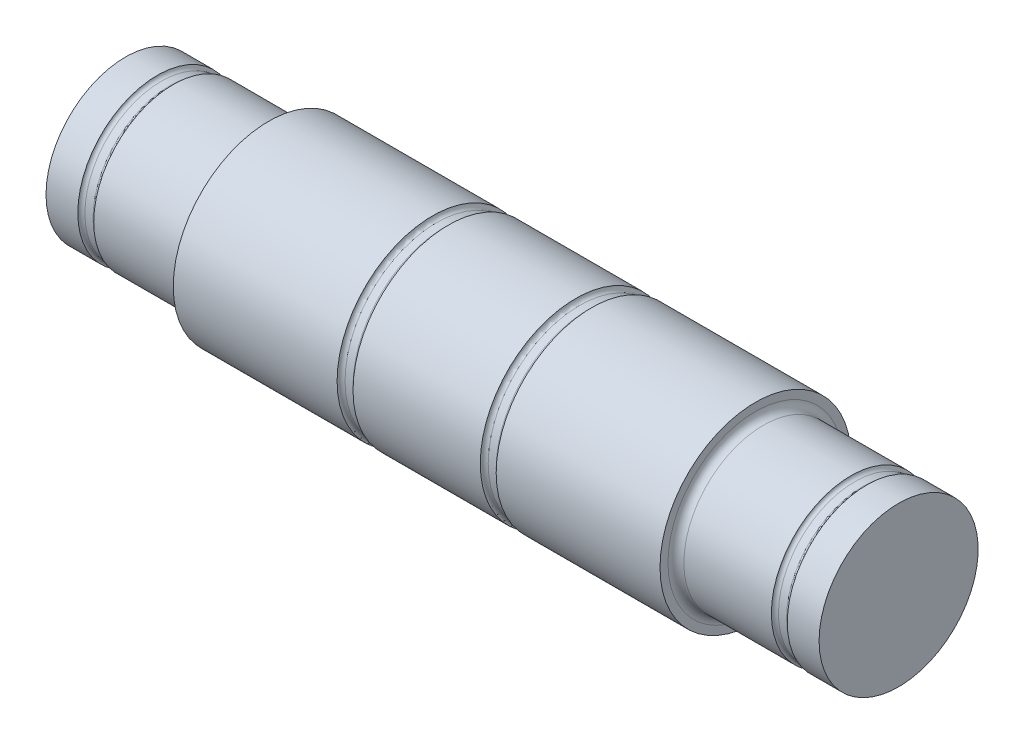
ISO-10303-21;
HEADER;
FILE_DESCRIPTION(('STEP AP214'),'2;1');
FILE_NAME('part.step','',(''),(''),'','','');
FILE_SCHEMA(('AUTOMOTIVE_DESIGN { 1 0 10303 214 1 1 1 1 }'));
ENDSEC;
DATA;
#1=APPLICATION_CONTEXT('core data for automotive mechanical design processes');
#2=APPLICATION_PROTOCOL_DEFINITION('international standard','automotive_design',2000,#1);
#3=PRODUCT_CONTEXT('',#1,'mechanical');
#4=PRODUCT('Part','Part','',(#3));
#5=PRODUCT_RELATED_PRODUCT_CATEGORY('part','',(#4));
#6=PRODUCT_DEFINITION_FORMATION('','',#4);
#7=PRODUCT_DEFINITION_CONTEXT('part definition',#1,'design');
#8=PRODUCT_DEFINITION('design','',#6,#7);
#9=PRODUCT_DEFINITION_SHAPE('','',#8);
#10=(LENGTH_UNIT() NAMED_UNIT(*) SI_UNIT(.MILLI.,.METRE.));
#11=(NAMED_UNIT(*) PLANE_ANGLE_UNIT() SI_UNIT($,.RADIAN.));
#12=(NAMED_UNIT(*) SI_UNIT($,.STERADIAN.) SOLID_ANGLE_UNIT());
#13=UNCERTAINTY_MEASURE_WITH_UNIT(LENGTH_MEASURE(1.E-05),#10,'distance_accuracy_value','');
#14=(GEOMETRIC_REPRESENTATION_CONTEXT(3) GLOBAL_UNCERTAINTY_ASSIGNED_CONTEXT((#13)) GLOBAL_UNIT_ASSIGNED_CONTEXT((#10,
#11,#12)) REPRESENTATION_CONTEXT('',''));
#15=CARTESIAN_POINT('',(0.,0.,0.));
#16=DIRECTION('',(0.,0.,1.));
#17=DIRECTION('',(1.,0.,0.));
#18=AXIS2_PLACEMENT_3D('',#15,#16,#17);
#19=CARTESIAN_POINT('',(-24.3,5.,0.));
#20=DIRECTION('',(1.,0.,0.));
#21=DIRECTION('',(0.,0.,-1.));
#22=AXIS2_PLACEMENT_3D('',#19,#20,#21);
#23=PLANE('',#22);
#24=CARTESIAN_POINT('',(-24.3,0.,0.));
#25=DIRECTION('',(-1.,0.,0.));
#26=DIRECTION('',(0.,0.,1.));
#27=AXIS2_PLACEMENT_3D('',#24,#25,#26);
#28=CIRCLE('',#27,5.);
#29=CARTESIAN_POINT('',(-24.3,0.,5.));
#30=VERTEX_POINT('',#29);
#31=EDGE_CURVE('E113',#30,#30,#28,.T.);
#32=ORIENTED_EDGE('',*,*,#31,.T.);
#33=EDGE_LOOP('',(#32));
#34=FACE_BOUND('',#33,.T.);
#35=ADVANCED_FACE('F36',(#34),#23,.F.);
#36=CARTESIAN_POINT('',(24.3,0.,0.));
#37=DIRECTION('',(-1.,0.,0.));
#38=DIRECTION('',(0.,0.,1.));
#39=AXIS2_PLACEMENT_3D('',#36,#37,#38);
#40=PLANE('',#39);
#41=CARTESIAN_POINT('',(24.3,0.,0.));
#42=DIRECTION('',(-1.,0.,0.));
#43=DIRECTION('',(0.,0.,1.));
#44=AXIS2_PLACEMENT_3D('',#41,#42,#43);
#45=CIRCLE('',#44,5.);
#46=CARTESIAN_POINT('',(24.3,0.,5.));
#47=VERTEX_POINT('',#46);
#48=EDGE_CURVE('E80',#47,#47,#45,.T.);
#49=ORIENTED_EDGE('',*,*,#48,.F.);
#50=EDGE_LOOP('',(#49));
#51=FACE_BOUND('',#50,.T.);
#52=ADVANCED_FACE('F135',(#51),#40,.F.);
#53=CARTESIAN_POINT('',(-24.3,0.,0.));
#54=DIRECTION('',(-1.,0.,0.));
#55=DIRECTION('',(0.,0.,1.));
#56=AXIS2_PLACEMENT_3D('',#53,#54,#55);
#57=CYLINDRICAL_SURFACE('',#56,5.);
#58=CARTESIAN_POINT('',(22.3,0.,0.));
#59=DIRECTION('',(-1.,0.,0.));
#60=DIRECTION('',(0.,0.,1.));
#61=AXIS2_PLACEMENT_3D('',#58,#59,#60);
#62=CIRCLE('',#61,5.);
#63=CARTESIAN_POINT('',(22.3,0.,5.));
#64=VERTEX_POINT('',#63);
#65=EDGE_CURVE('E83',#64,#64,#62,.T.);
#66=ORIENTED_EDGE('',*,*,#65,.F.);
#67=EDGE_LOOP('',(#66));
#68=FACE_BOUND('',#67,.T.);
#69=ORIENTED_EDGE('',*,*,#48,.T.);
#70=EDGE_LOOP('',(#69));
#71=FACE_BOUND('',#70,.T.);
#72=ADVANCED_FACE('F140',(#68,#71),#57,.T.);
#73=CARTESIAN_POINT('',(-24.3,0.,0.));
#74=DIRECTION('',(-1.,0.,0.));
#75=DIRECTION('',(0.,0.,1.));
#76=AXIS2_PLACEMENT_3D('',#73,#74,#75);
#77=CYLINDRICAL_SURFACE('',#76,4.8);
#78=CARTESIAN_POINT('',(22.0550510257217,0.,0.));
#79=DIRECTION('',(1.,0.,0.));
#80=DIRECTION('',(0.,0.,-1.));
#81=AXIS2_PLACEMENT_3D('',#78,#79,#80);
#82=CIRCLE('',#81,4.8);
#83=CARTESIAN_POINT('',(22.0550510257217,0.,-4.8));
#84=VERTEX_POINT('',#83);
#85=EDGE_CURVE('E47',#84,#84,#82,.F.);
#86=ORIENTED_EDGE('',*,*,#85,.T.);
#87=EDGE_LOOP('',(#86));
#88=FACE_BOUND('',#87,.T.);
#89=CARTESIAN_POINT('',(21.5449489742783,0.,0.));
#90=DIRECTION('',(-1.,0.,0.));
#91=DIRECTION('',(0.,0.,1.));
#92=AXIS2_PLACEMENT_3D('',#89,#90,#91);
#93=CIRCLE('',#92,4.8);
#94=CARTESIAN_POINT('',(21.5449489742783,0.,4.8));
#95=VERTEX_POINT('',#94);
#96=EDGE_CURVE('E51',#95,#95,#93,.F.);
#97=ORIENTED_EDGE('',*,*,#96,.T.);
#98=EDGE_LOOP('',(#97));
#99=FACE_BOUND('',#98,.T.);
#100=ADVANCED_FACE('F183',(#88,#99),#77,.T.);
#101=CARTESIAN_POINT('',(-24.3,0.,0.));
#102=DIRECTION('',(-1.,0.,0.));
#103=DIRECTION('',(0.,0.,1.));
#104=AXIS2_PLACEMENT_3D('',#101,#102,#103);
#105=CYLINDRICAL_SURFACE('',#104,5.);
#106=CARTESIAN_POINT('',(15.8,0.,0.));
#107=DIRECTION('',(-1.,0.,0.));
#108=DIRECTION('',(0.,0.,1.));
#109=AXIS2_PLACEMENT_3D('',#106,#107,#108);
#110=CIRCLE('',#109,5.);
#111=CARTESIAN_POINT('',(15.8,0.,5.));
#112=VERTEX_POINT('',#111);
#113=EDGE_CURVE('E74',#112,#112,#110,.F.);
#114=ORIENTED_EDGE('',*,*,#113,.T.);
#115=EDGE_LOOP('',(#114));
#116=FACE_BOUND('',#115,.T.);
#117=CARTESIAN_POINT('',(21.3,0.,0.));
#118=DIRECTION('',(-1.,0.,0.));
#119=DIRECTION('',(0.,0.,1.));
#120=AXIS2_PLACEMENT_3D('',#117,#118,#119);
#121=CIRCLE('',#120,5.);
#122=CARTESIAN_POINT('',(21.3,0.,5.));
#123=VERTEX_POINT('',#122);
#124=EDGE_CURVE('E86',#123,#123,#121,.T.);
#125=ORIENTED_EDGE('',*,*,#124,.T.);
#126=EDGE_LOOP('',(#125));
#127=FACE_BOUND('',#126,.T.);
#128=ADVANCED_FACE('F180',(#116,#127),#105,.T.);
#129=CARTESIAN_POINT('',(15.3,5.,0.));
#130=DIRECTION('',(-1.,0.,0.));
#131=DIRECTION('',(0.,0.,1.));
#132=AXIS2_PLACEMENT_3D('',#129,#130,#131);
#133=PLANE('',#132);
#134=CARTESIAN_POINT('',(15.3,0.,0.));
#135=DIRECTION('',(-1.,0.,0.));
#136=DIRECTION('',(0.,0.,1.));
#137=AXIS2_PLACEMENT_3D('',#134,#135,#136);
#138=CIRCLE('',#137,5.5);
#139=CARTESIAN_POINT('',(15.3,0.,5.5));
#140=VERTEX_POINT('',#139);
#141=EDGE_CURVE('E77',#140,#140,#138,.T.);
#142=ORIENTED_EDGE('',*,*,#141,.T.);
#143=EDGE_LOOP('',(#142));
#144=FACE_BOUND('',#143,.T.);
#145=CARTESIAN_POINT('',(15.3,0.,0.));
#146=DIRECTION('',(-1.,0.,0.));
#147=DIRECTION('',(0.,0.,1.));
#148=AXIS2_PLACEMENT_3D('',#145,#146,#147);
#149=CIRCLE('',#148,6.);
#150=CARTESIAN_POINT('',(15.3,0.,6.));
#151=VERTEX_POINT('',#150);
#152=EDGE_CURVE('E89',#151,#151,#149,.T.);
#153=ORIENTED_EDGE('',*,*,#152,.F.);
#154=EDGE_LOOP('',(#153));
#155=FACE_BOUND('',#154,.T.);
#156=ADVANCED_FACE('F182',(#144,#155),#133,.F.);
#157=CARTESIAN_POINT('',(-24.3,0.,0.));
#158=DIRECTION('',(-1.,0.,0.));
#159=DIRECTION('',(0.,0.,1.));
#160=AXIS2_PLACEMENT_3D('',#157,#158,#159);
#161=CYLINDRICAL_SURFACE('',#160,6.);
#162=CARTESIAN_POINT('',(5.,0.,0.));
#163=DIRECTION('',(-1.,0.,0.));
#164=DIRECTION('',(0.,0.,1.));
#165=AXIS2_PLACEMENT_3D('',#162,#163,#164);
#166=CIRCLE('',#165,6.);
#167=CARTESIAN_POINT('',(5.,0.,6.));
#168=VERTEX_POINT('',#167);
#169=EDGE_CURVE('E92',#168,#168,#166,.T.);
#170=ORIENTED_EDGE('',*,*,#169,.F.);
#171=EDGE_LOOP('',(#170));
#172=FACE_BOUND('',#171,.T.);
#173=ORIENTED_EDGE('',*,*,#152,.T.);
#174=EDGE_LOOP('',(#173));
#175=FACE_BOUND('',#174,.T.);
#176=ADVANCED_FACE('F190',(#172,#175),#161,.T.);
#177=CARTESIAN_POINT('',(-24.3,0.,0.));
#178=DIRECTION('',(-1.,0.,0.));
#179=DIRECTION('',(0.,0.,1.));
#180=AXIS2_PLACEMENT_3D('',#177,#178,#179);
#181=CYLINDRICAL_SURFACE('',#180,5.75);
#182=CARTESIAN_POINT('',(4.25,0.,0.));
#183=DIRECTION('',(-1.,0.,0.));
#184=DIRECTION('',(0.,0.,1.));
#185=AXIS2_PLACEMENT_3D('',#182,#183,#184);
#186=CIRCLE('',#185,5.75);
#187=CARTESIAN_POINT('',(4.25,0.,5.75));
#188=VERTEX_POINT('',#187);
#189=EDGE_CURVE('E56',#188,#188,#186,.F.);
#190=ORIENTED_EDGE('',*,*,#189,.T.);
#191=EDGE_LOOP('',(#190));
#192=FACE_BOUND('',#191,.T.);
#193=CARTESIAN_POINT('',(4.75,0.,0.));
#194=DIRECTION('',(1.,0.,0.));
#195=DIRECTION('',(0.,0.,-1.));
#196=AXIS2_PLACEMENT_3D('',#193,#194,#195);
#197=CIRCLE('',#196,5.75);
#198=CARTESIAN_POINT('',(4.75,0.,-5.75));
#199=VERTEX_POINT('',#198);
#200=EDGE_CURVE('E59',#199,#199,#197,.F.);
#201=ORIENTED_EDGE('',*,*,#200,.T.);
#202=EDGE_LOOP('',(#201));
#203=FACE_BOUND('',#202,.T.);
#204=ADVANCED_FACE('F236',(#192,#203),#181,.T.);
#205=CARTESIAN_POINT('',(-24.3,0.,0.));
#206=DIRECTION('',(-1.,0.,0.));
#207=DIRECTION('',(0.,0.,1.));
#208=AXIS2_PLACEMENT_3D('',#205,#206,#207);
#209=CYLINDRICAL_SURFACE('',#208,6.);
#210=CARTESIAN_POINT('',(-4.,0.,0.));
#211=DIRECTION('',(-1.,0.,0.));
#212=DIRECTION('',(0.,0.,1.));
#213=AXIS2_PLACEMENT_3D('',#210,#211,#212);
#214=CIRCLE('',#213,6.);
#215=CARTESIAN_POINT('',(-4.,0.,6.));
#216=VERTEX_POINT('',#215);
#217=EDGE_CURVE('E98',#216,#216,#214,.T.);
#218=ORIENTED_EDGE('',*,*,#217,.F.);
#219=EDGE_LOOP('',(#218));
#220=FACE_BOUND('',#219,.T.);
#221=CARTESIAN_POINT('',(4.,0.,0.));
#222=DIRECTION('',(-1.,0.,0.));
#223=DIRECTION('',(0.,0.,1.));
#224=AXIS2_PLACEMENT_3D('',#221,#222,#223);
#225=CIRCLE('',#224,6.);
#226=CARTESIAN_POINT('',(4.,0.,6.));
#227=VERTEX_POINT('',#226);
#228=EDGE_CURVE('E95',#227,#227,#225,.T.);
#229=ORIENTED_EDGE('',*,*,#228,.T.);
#230=EDGE_LOOP('',(#229));
#231=FACE_BOUND('',#230,.T.);
#232=ADVANCED_FACE('F241',(#220,#231),#209,.T.);
#233=CARTESIAN_POINT('',(-24.3,0.,0.));
#234=DIRECTION('',(-1.,0.,0.));
#235=DIRECTION('',(0.,0.,1.));
#236=AXIS2_PLACEMENT_3D('',#233,#234,#235);
#237=CYLINDRICAL_SURFACE('',#236,5.75);
#238=CARTESIAN_POINT('',(-4.25,0.,0.));
#239=DIRECTION('',(1.,0.,0.));
#240=DIRECTION('',(0.,0.,-1.));
#241=AXIS2_PLACEMENT_3D('',#238,#239,#240);
#242=CIRCLE('',#241,5.75);
#243=CARTESIAN_POINT('',(-4.25,0.,-5.75));
#244=VERTEX_POINT('',#243);
#245=EDGE_CURVE('E62',#244,#244,#242,.F.);
#246=ORIENTED_EDGE('',*,*,#245,.T.);
#247=EDGE_LOOP('',(#246));
#248=FACE_BOUND('',#247,.T.);
#249=CARTESIAN_POINT('',(-4.75,0.,0.));
#250=DIRECTION('',(-1.,0.,0.));
#251=DIRECTION('',(0.,0.,1.));
#252=AXIS2_PLACEMENT_3D('',#249,#250,#251);
#253=CIRCLE('',#252,5.75);
#254=CARTESIAN_POINT('',(-4.75,0.,5.75));
#255=VERTEX_POINT('',#254);
#256=EDGE_CURVE('E65',#255,#255,#253,.F.);
#257=ORIENTED_EDGE('',*,*,#256,.T.);
#258=EDGE_LOOP('',(#257));
#259=FACE_BOUND('',#258,.T.);
#260=ADVANCED_FACE('F249',(#248,#259),#237,.T.);
#261=CARTESIAN_POINT('',(-24.3,0.,0.));
#262=DIRECTION('',(-1.,0.,0.));
#263=DIRECTION('',(0.,0.,1.));
#264=AXIS2_PLACEMENT_3D('',#261,#262,#263);
#265=CYLINDRICAL_SURFACE('',#264,6.);
#266=CARTESIAN_POINT('',(-15.3,0.,0.));
#267=DIRECTION('',(-1.,0.,0.));
#268=DIRECTION('',(0.,0.,1.));
#269=AXIS2_PLACEMENT_3D('',#266,#267,#268);
#270=CIRCLE('',#269,6.);
#271=CARTESIAN_POINT('',(-15.3,0.,6.));
#272=VERTEX_POINT('',#271);
#273=EDGE_CURVE('E104',#272,#272,#270,.T.);
#274=ORIENTED_EDGE('',*,*,#273,.F.);
#275=EDGE_LOOP('',(#274));
#276=FACE_BOUND('',#275,.T.);
#277=CARTESIAN_POINT('',(-5.,0.,0.));
#278=DIRECTION('',(-1.,0.,0.));
#279=DIRECTION('',(0.,0.,1.));
#280=AXIS2_PLACEMENT_3D('',#277,#278,#279);
#281=CIRCLE('',#280,6.);
#282=CARTESIAN_POINT('',(-5.,0.,6.));
#283=VERTEX_POINT('',#282);
#284=EDGE_CURVE('E101',#283,#283,#281,.T.);
#285=ORIENTED_EDGE('',*,*,#284,.T.);
#286=EDGE_LOOP('',(#285));
#287=FACE_BOUND('',#286,.T.);
#288=ADVANCED_FACE('F254',(#276,#287),#265,.T.);
#289=CARTESIAN_POINT('',(-15.3,6.,0.));
#290=DIRECTION('',(1.,0.,0.));
#291=DIRECTION('',(0.,0.,-1.));
#292=AXIS2_PLACEMENT_3D('',#289,#290,#291);
#293=PLANE('',#292);
#294=CARTESIAN_POINT('',(-15.3,0.,0.));
#295=DIRECTION('',(1.,0.,0.));
#296=DIRECTION('',(0.,0.,-1.));
#297=AXIS2_PLACEMENT_3D('',#294,#295,#296);
#298=CIRCLE('',#297,5.5);
#299=CARTESIAN_POINT('',(-15.3,0.,-5.5));
#300=VERTEX_POINT('',#299);
#301=EDGE_CURVE('E68',#300,#300,#298,.T.);
#302=ORIENTED_EDGE('',*,*,#301,.T.);
#303=EDGE_LOOP('',(#302));
#304=FACE_BOUND('',#303,.T.);
#305=ORIENTED_EDGE('',*,*,#273,.T.);
#306=EDGE_LOOP('',(#305));
#307=FACE_BOUND('',#306,.T.);
#308=ADVANCED_FACE('F262',(#304,#307),#293,.F.);
#309=CARTESIAN_POINT('',(-24.3,0.,0.));
#310=DIRECTION('',(-1.,0.,0.));
#311=DIRECTION('',(0.,0.,1.));
#312=AXIS2_PLACEMENT_3D('',#309,#310,#311);
#313=CYLINDRICAL_SURFACE('',#312,5.);
#314=CARTESIAN_POINT('',(-15.8,0.,0.));
#315=DIRECTION('',(1.,0.,0.));
#316=DIRECTION('',(0.,0.,-1.));
#317=AXIS2_PLACEMENT_3D('',#314,#315,#316);
#318=CIRCLE('',#317,5.);
#319=CARTESIAN_POINT('',(-15.8,0.,-5.));
#320=VERTEX_POINT('',#319);
#321=EDGE_CURVE('E71',#320,#320,#318,.F.);
#322=ORIENTED_EDGE('',*,*,#321,.T.);
#323=EDGE_LOOP('',(#322));
#324=FACE_BOUND('',#323,.T.);
#325=CARTESIAN_POINT('',(-21.3,0.,0.));
#326=DIRECTION('',(-1.,0.,0.));
#327=DIRECTION('',(0.,0.,1.));
#328=AXIS2_PLACEMENT_3D('',#325,#326,#327);
#329=CIRCLE('',#328,5.);
#330=CARTESIAN_POINT('',(-21.3,0.,5.));
#331=VERTEX_POINT('',#330);
#332=EDGE_CURVE('E107',#331,#331,#329,.T.);
#333=ORIENTED_EDGE('',*,*,#332,.F.);
#334=EDGE_LOOP('',(#333));
#335=FACE_BOUND('',#334,.T.);
#336=ADVANCED_FACE('F267',(#324,#335),#313,.T.);
#337=CARTESIAN_POINT('',(-24.3,0.,0.));
#338=DIRECTION('',(-1.,0.,0.));
#339=DIRECTION('',(0.,0.,1.));
#340=AXIS2_PLACEMENT_3D('',#337,#338,#339);
#341=CYLINDRICAL_SURFACE('',#340,4.8);
#342=CARTESIAN_POINT('',(-21.5449489742783,0.,0.));
#343=DIRECTION('',(1.,0.,0.));
#344=DIRECTION('',(0.,0.,-1.));
#345=AXIS2_PLACEMENT_3D('',#342,#343,#344);
#346=CIRCLE('',#345,4.8);
#347=CARTESIAN_POINT('',(-21.5449489742783,0.,-4.8));
#348=VERTEX_POINT('',#347);
#349=EDGE_CURVE('E11',#348,#348,#346,.F.);
#350=ORIENTED_EDGE('',*,*,#349,.T.);
#351=EDGE_LOOP('',(#350));
#352=FACE_BOUND('',#351,.T.);
#353=CARTESIAN_POINT('',(-22.0550510257217,0.,0.));
#354=DIRECTION('',(-1.,0.,0.));
#355=DIRECTION('',(0.,0.,1.));
#356=AXIS2_PLACEMENT_3D('',#353,#354,#355);
#357=CIRCLE('',#356,4.8);
#358=CARTESIAN_POINT('',(-22.0550510257217,0.,4.8));
#359=VERTEX_POINT('',#358);
#360=EDGE_CURVE('E43',#359,#359,#357,.F.);
#361=ORIENTED_EDGE('',*,*,#360,.T.);
#362=EDGE_LOOP('',(#361));
#363=FACE_BOUND('',#362,.T.);
#364=ADVANCED_FACE('F122',(#352,#363),#341,.T.);
#365=CARTESIAN_POINT('',(-24.3,0.,0.));
#366=DIRECTION('',(-1.,0.,0.));
#367=DIRECTION('',(0.,0.,1.));
#368=AXIS2_PLACEMENT_3D('',#365,#366,#367);
#369=CYLINDRICAL_SURFACE('',#368,5.);
#370=ORIENTED_EDGE('',*,*,#31,.F.);
#371=EDGE_LOOP('',(#370));
#372=FACE_BOUND('',#371,.T.);
#373=CARTESIAN_POINT('',(-22.3,0.,0.));
#374=DIRECTION('',(-1.,0.,0.));
#375=DIRECTION('',(0.,0.,1.));
#376=AXIS2_PLACEMENT_3D('',#373,#374,#375);
#377=CIRCLE('',#376,5.);
#378=CARTESIAN_POINT('',(-22.3,0.,5.));
#379=VERTEX_POINT('',#378);
#380=EDGE_CURVE('E110',#379,#379,#377,.T.);
#381=ORIENTED_EDGE('',*,*,#380,.T.);
#382=EDGE_LOOP('',(#381));
#383=FACE_BOUND('',#382,.T.);
#384=ADVANCED_FACE('F118',(#372,#383),#369,.T.);
#385=CARTESIAN_POINT('',(15.8,0.,0.));
#386=DIRECTION('',(-1.,0.,0.));
#387=DIRECTION('',(0.,0.,1.));
#388=AXIS2_PLACEMENT_3D('',#385,#386,#387);
#389=TOROIDAL_SURFACE('',#388,5.5,0.5);
#390=ORIENTED_EDGE('',*,*,#113,.F.);
#391=EDGE_LOOP('',(#390));
#392=FACE_BOUND('',#391,.T.);
#393=ORIENTED_EDGE('',*,*,#141,.F.);
#394=EDGE_LOOP('',(#393));
#395=FACE_BOUND('',#394,.T.);
#396=ADVANCED_FACE('F121',(#392,#395),#389,.F.);
#397=CARTESIAN_POINT('',(-15.8,0.,0.));
#398=DIRECTION('',(1.,0.,0.));
#399=DIRECTION('',(0.,0.,-1.));
#400=AXIS2_PLACEMENT_3D('',#397,#398,#399);
#401=TOROIDAL_SURFACE('',#400,5.5,0.5);
#402=ORIENTED_EDGE('',*,*,#301,.F.);
#403=EDGE_LOOP('',(#402));
#404=FACE_BOUND('',#403,.T.);
#405=ORIENTED_EDGE('',*,*,#321,.F.);
#406=EDGE_LOOP('',(#405));
#407=FACE_BOUND('',#406,.T.);
#408=ADVANCED_FACE('F147',(#404,#407),#401,.F.);
#409=CARTESIAN_POINT('',(-4.25,0.,0.));
#410=DIRECTION('',(1.,0.,0.));
#411=DIRECTION('',(0.,0.,-1.));
#412=AXIS2_PLACEMENT_3D('',#409,#410,#411);
#413=TOROIDAL_SURFACE('',#412,6.,0.25);
#414=ORIENTED_EDGE('',*,*,#217,.T.);
#415=EDGE_LOOP('',(#414));
#416=FACE_BOUND('',#415,.T.);
#417=ORIENTED_EDGE('',*,*,#245,.F.);
#418=EDGE_LOOP('',(#417));
#419=FACE_BOUND('',#418,.T.);
#420=ADVANCED_FACE('F151',(#416,#419),#413,.F.);
#421=CARTESIAN_POINT('',(-4.75,0.,0.));
#422=DIRECTION('',(-1.,0.,0.));
#423=DIRECTION('',(0.,0.,1.));
#424=AXIS2_PLACEMENT_3D('',#421,#422,#423);
#425=TOROIDAL_SURFACE('',#424,6.,0.25);
#426=ORIENTED_EDGE('',*,*,#256,.F.);
#427=EDGE_LOOP('',(#426));
#428=FACE_BOUND('',#427,.T.);
#429=ORIENTED_EDGE('',*,*,#284,.F.);
#430=EDGE_LOOP('',(#429));
#431=FACE_BOUND('',#430,.T.);
#432=ADVANCED_FACE('F155',(#428,#431),#425,.F.);
#433=CARTESIAN_POINT('',(4.25,0.,0.));
#434=DIRECTION('',(-1.,0.,0.));
#435=DIRECTION('',(0.,0.,1.));
#436=AXIS2_PLACEMENT_3D('',#433,#434,#435);
#437=TOROIDAL_SURFACE('',#436,6.,0.25);
#438=ORIENTED_EDGE('',*,*,#189,.F.);
#439=EDGE_LOOP('',(#438));
#440=FACE_BOUND('',#439,.T.);
#441=ORIENTED_EDGE('',*,*,#228,.F.);
#442=EDGE_LOOP('',(#441));
#443=FACE_BOUND('',#442,.T.);
#444=ADVANCED_FACE('F159',(#440,#443),#437,.F.);
#445=CARTESIAN_POINT('',(4.75,0.,0.));
#446=DIRECTION('',(1.,0.,0.));
#447=DIRECTION('',(0.,0.,-1.));
#448=AXIS2_PLACEMENT_3D('',#445,#446,#447);
#449=TOROIDAL_SURFACE('',#448,6.,0.25);
#450=ORIENTED_EDGE('',*,*,#169,.T.);
#451=EDGE_LOOP('',(#450));
#452=FACE_BOUND('',#451,.T.);
#453=ORIENTED_EDGE('',*,*,#200,.F.);
#454=EDGE_LOOP('',(#453));
#455=FACE_BOUND('',#454,.T.);
#456=ADVANCED_FACE('F163',(#452,#455),#449,.F.);
#457=CARTESIAN_POINT('',(22.0550510257217,0.,0.));
#458=DIRECTION('',(1.,0.,0.));
#459=DIRECTION('',(0.,0.,-1.));
#460=AXIS2_PLACEMENT_3D('',#457,#458,#459);
#461=TOROIDAL_SURFACE('',#460,5.05,0.25);
#462=ORIENTED_EDGE('',*,*,#65,.T.);
#463=EDGE_LOOP('',(#462));
#464=FACE_BOUND('',#463,.T.);
#465=ORIENTED_EDGE('',*,*,#85,.F.);
#466=EDGE_LOOP('',(#465));
#467=FACE_BOUND('',#466,.T.);
#468=ADVANCED_FACE('F167',(#464,#467),#461,.F.);
#469=CARTESIAN_POINT('',(21.5449489742783,0.,0.));
#470=DIRECTION('',(-1.,0.,0.));
#471=DIRECTION('',(0.,0.,1.));
#472=AXIS2_PLACEMENT_3D('',#469,#470,#471);
#473=TOROIDAL_SURFACE('',#472,5.05,0.25);
#474=ORIENTED_EDGE('',*,*,#96,.F.);
#475=EDGE_LOOP('',(#474));
#476=FACE_BOUND('',#475,.T.);
#477=ORIENTED_EDGE('',*,*,#124,.F.);
#478=EDGE_LOOP('',(#477));
#479=FACE_BOUND('',#478,.T.);
#480=ADVANCED_FACE('F132',(#476,#479),#473,.F.);
#481=CARTESIAN_POINT('',(-21.5449489742783,0.,0.));
#482=DIRECTION('',(1.,0.,0.));
#483=DIRECTION('',(0.,0.,-1.));
#484=AXIS2_PLACEMENT_3D('',#481,#482,#483);
#485=TOROIDAL_SURFACE('',#484,5.05,0.25);
#486=ORIENTED_EDGE('',*,*,#332,.T.);
#487=EDGE_LOOP('',(#486));
#488=FACE_BOUND('',#487,.T.);
#489=ORIENTED_EDGE('',*,*,#349,.F.);
#490=EDGE_LOOP('',(#489));
#491=FACE_BOUND('',#490,.T.);
#492=ADVANCED_FACE('F127',(#488,#491),#485,.F.);
#493=CARTESIAN_POINT('',(-22.0550510257217,0.,0.));
#494=DIRECTION('',(-1.,0.,0.));
#495=DIRECTION('',(0.,0.,1.));
#496=AXIS2_PLACEMENT_3D('',#493,#494,#495);
#497=TOROIDAL_SURFACE('',#496,5.05,0.25);
#498=ORIENTED_EDGE('',*,*,#360,.F.);
#499=EDGE_LOOP('',(#498));
#500=FACE_BOUND('',#499,.T.);
#501=ORIENTED_EDGE('',*,*,#380,.F.);
#502=EDGE_LOOP('',(#501));
#503=FACE_BOUND('',#502,.T.);
#504=ADVANCED_FACE('F38',(#500,#503),#497,.F.);
#505=CLOSED_SHELL('',(#35,#52,#72,#100,#128,#156,#176,#204,#232,#260,#288,#308,#336,#364,#384,
#396,#408,#420,#432,#444,#456,#468,#480,#492,#504));
#506=MANIFOLD_SOLID_BREP('B2',#505);
#507=ADVANCED_BREP_SHAPE_REPRESENTATION('',(#18,#506),#14);
#508=SHAPE_DEFINITION_REPRESENTATION(#9,#507);
ENDSEC;
END-ISO-10303-21;
